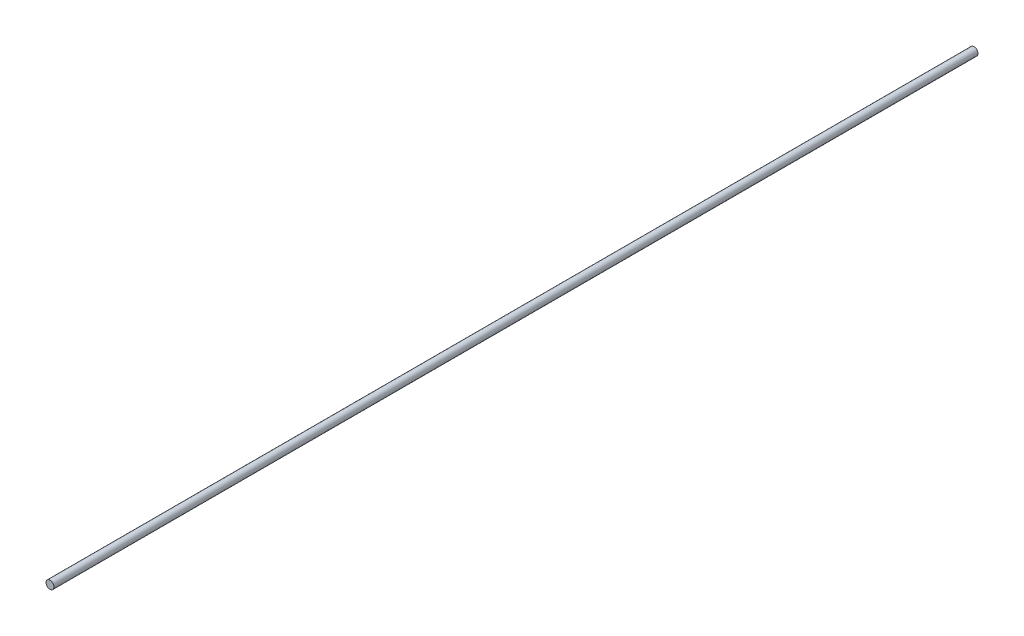
ISO-10303-21;
HEADER;
FILE_DESCRIPTION(('STEP AP214'),'2;1');
FILE_NAME('part.step','',(''),(''),'','','');
FILE_SCHEMA(('AUTOMOTIVE_DESIGN { 1 0 10303 214 1 1 1 1 }'));
ENDSEC;
DATA;
#1=APPLICATION_CONTEXT('core data for automotive mechanical design processes');
#2=APPLICATION_PROTOCOL_DEFINITION('international standard','automotive_design',2000,#1);
#3=PRODUCT_CONTEXT('',#1,'mechanical');
#4=PRODUCT('Part','Part','',(#3));
#5=PRODUCT_RELATED_PRODUCT_CATEGORY('part','',(#4));
#6=PRODUCT_DEFINITION_FORMATION('','',#4);
#7=PRODUCT_DEFINITION_CONTEXT('part definition',#1,'design');
#8=PRODUCT_DEFINITION('design','',#6,#7);
#9=PRODUCT_DEFINITION_SHAPE('','',#8);
#10=(LENGTH_UNIT() NAMED_UNIT(*) SI_UNIT(.MILLI.,.METRE.));
#11=(NAMED_UNIT(*) PLANE_ANGLE_UNIT() SI_UNIT($,.RADIAN.));
#12=(NAMED_UNIT(*) SI_UNIT($,.STERADIAN.) SOLID_ANGLE_UNIT());
#13=UNCERTAINTY_MEASURE_WITH_UNIT(LENGTH_MEASURE(1.E-05),#10,'distance_accuracy_value','');
#14=(GEOMETRIC_REPRESENTATION_CONTEXT(3) GLOBAL_UNCERTAINTY_ASSIGNED_CONTEXT((#13)) GLOBAL_UNIT_ASSIGNED_CONTEXT((#10,
#11,#12)) REPRESENTATION_CONTEXT('',''));
#15=CARTESIAN_POINT('',(0.,0.,0.));
#16=DIRECTION('',(0.,0.,1.));
#17=DIRECTION('',(1.,0.,0.));
#18=AXIS2_PLACEMENT_3D('',#15,#16,#17);
#19=CARTESIAN_POINT('',(0.,0.,93.3537619843339));
#20=DIRECTION('',(0.,0.,-1.));
#21=DIRECTION('',(-1.,0.,0.));
#22=AXIS2_PLACEMENT_3D('',#19,#20,#21);
#23=CYLINDRICAL_SURFACE('',#22,0.4);
#24=CARTESIAN_POINT('',(0.,0.,93.3537619843339));
#25=DIRECTION('',(0.,0.,1.));
#26=DIRECTION('',(1.,0.,0.));
#27=AXIS2_PLACEMENT_3D('',#24,#25,#26);
#28=CIRCLE('',#27,0.4);
#29=CARTESIAN_POINT('',(0.4,0.,93.3537619843339));
#30=VERTEX_POINT('',#29);
#31=EDGE_CURVE('E10',#30,#30,#28,.T.);
#32=ORIENTED_EDGE('',*,*,#31,.F.);
#33=EDGE_LOOP('',(#32));
#34=FACE_BOUND('',#33,.T.);
#35=CARTESIAN_POINT('',(0.,0.,0.));
#36=DIRECTION('',(0.,0.,1.));
#37=DIRECTION('',(1.,0.,0.));
#38=AXIS2_PLACEMENT_3D('',#35,#36,#37);
#39=CIRCLE('',#38,0.4);
#40=CARTESIAN_POINT('',(0.4,0.,0.));
#41=VERTEX_POINT('',#40);
#42=EDGE_CURVE('E40',#41,#41,#39,.T.);
#43=ORIENTED_EDGE('',*,*,#42,.T.);
#44=EDGE_LOOP('',(#43));
#45=FACE_BOUND('',#44,.T.);
#46=ADVANCED_FACE('F37',(#34,#45),#23,.T.);
#47=CARTESIAN_POINT('',(0.,0.,93.3537619843339));
#48=DIRECTION('',(0.,0.,1.));
#49=DIRECTION('',(1.,0.,0.));
#50=AXIS2_PLACEMENT_3D('',#47,#48,#49);
#51=PLANE('',#50);
#52=ORIENTED_EDGE('',*,*,#31,.T.);
#53=EDGE_LOOP('',(#52));
#54=FACE_BOUND('',#53,.T.);
#55=ADVANCED_FACE('F52',(#54),#51,.T.);
#56=CARTESIAN_POINT('',(0.,0.,0.));
#57=DIRECTION('',(0.,0.,1.));
#58=DIRECTION('',(1.,0.,0.));
#59=AXIS2_PLACEMENT_3D('',#56,#57,#58);
#60=PLANE('',#59);
#61=ORIENTED_EDGE('',*,*,#42,.F.);
#62=EDGE_LOOP('',(#61));
#63=FACE_BOUND('',#62,.T.);
#64=ADVANCED_FACE('F50',(#63),#60,.F.);
#65=CLOSED_SHELL('',(#46,#55,#64));
#66=MANIFOLD_SOLID_BREP('B2',#65);
#67=ADVANCED_BREP_SHAPE_REPRESENTATION('',(#18,#66),#14);
#68=SHAPE_DEFINITION_REPRESENTATION(#9,#67);
ENDSEC;
END-ISO-10303-21;
